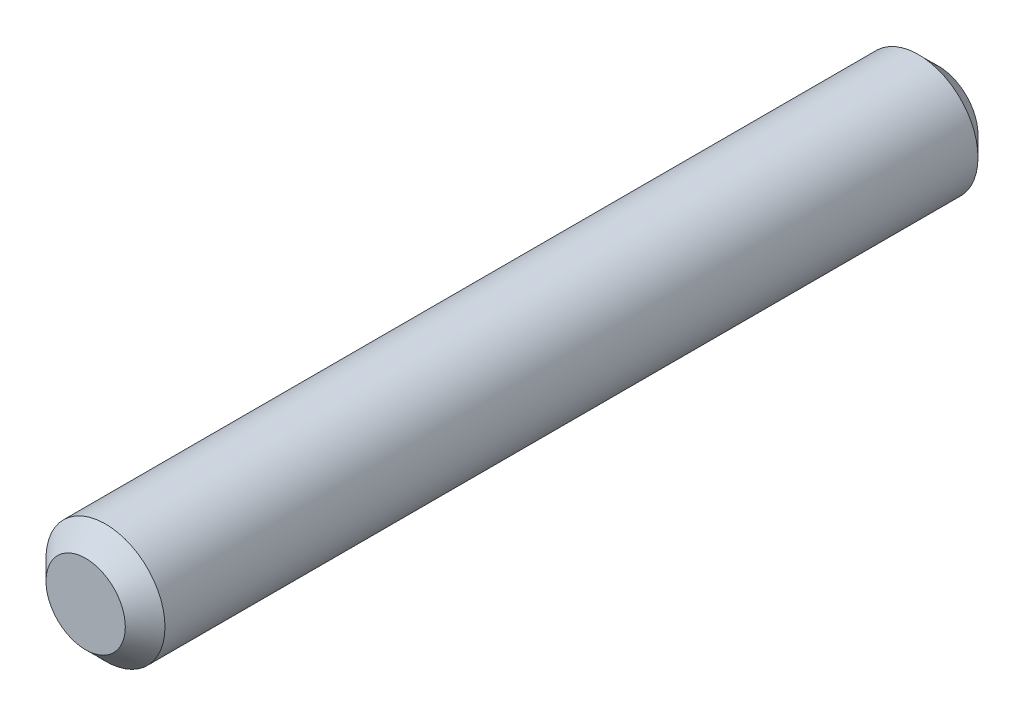
ISO-10303-21;
HEADER;
FILE_DESCRIPTION(('STEP AP214'),'2;1');
FILE_NAME('part.step','',(''),(''),'','','');
FILE_SCHEMA(('AUTOMOTIVE_DESIGN { 1 0 10303 214 1 1 1 1 }'));
ENDSEC;
DATA;
#1=APPLICATION_CONTEXT('core data for automotive mechanical design processes');
#2=APPLICATION_PROTOCOL_DEFINITION('international standard','automotive_design',2000,#1);
#3=PRODUCT_CONTEXT('',#1,'mechanical');
#4=PRODUCT('Part','Part','',(#3));
#5=PRODUCT_RELATED_PRODUCT_CATEGORY('part','',(#4));
#6=PRODUCT_DEFINITION_FORMATION('','',#4);
#7=PRODUCT_DEFINITION_CONTEXT('part definition',#1,'design');
#8=PRODUCT_DEFINITION('design','',#6,#7);
#9=PRODUCT_DEFINITION_SHAPE('','',#8);
#10=(LENGTH_UNIT() NAMED_UNIT(*) SI_UNIT(.MILLI.,.METRE.));
#11=(NAMED_UNIT(*) PLANE_ANGLE_UNIT() SI_UNIT($,.RADIAN.));
#12=(NAMED_UNIT(*) SI_UNIT($,.STERADIAN.) SOLID_ANGLE_UNIT());
#13=UNCERTAINTY_MEASURE_WITH_UNIT(LENGTH_MEASURE(1.E-05),#10,'distance_accuracy_value','');
#14=(GEOMETRIC_REPRESENTATION_CONTEXT(3) GLOBAL_UNCERTAINTY_ASSIGNED_CONTEXT((#13)) GLOBAL_UNIT_ASSIGNED_CONTEXT((#10,
#11,#12)) REPRESENTATION_CONTEXT('',''));
#15=CARTESIAN_POINT('',(0.,0.,0.));
#16=DIRECTION('',(0.,0.,1.));
#17=DIRECTION('',(1.,0.,0.));
#18=AXIS2_PLACEMENT_3D('',#15,#16,#17);
#19=CARTESIAN_POINT('',(0.,0.,43.));
#20=DIRECTION('',(0.,0.,-1.));
#21=DIRECTION('',(-1.,0.,0.));
#22=AXIS2_PLACEMENT_3D('',#19,#20,#21);
#23=CYLINDRICAL_SURFACE('',#22,3.);
#24=CARTESIAN_POINT('',(0.,0.,1.00000000000001));
#25=DIRECTION('',(0.,0.,1.));
#26=DIRECTION('',(1.,0.,0.));
#27=AXIS2_PLACEMENT_3D('',#24,#25,#26);
#28=CIRCLE('',#27,3.);
#29=CARTESIAN_POINT('',(3.,0.,1.00000000000001));
#30=VERTEX_POINT('',#29);
#31=EDGE_CURVE('E52',#30,#30,#28,.T.);
#32=ORIENTED_EDGE('',*,*,#31,.T.);
#33=EDGE_LOOP('',(#32));
#34=FACE_BOUND('',#33,.T.);
#35=CARTESIAN_POINT('',(0.,0.,42.));
#36=DIRECTION('',(0.,0.,1.));
#37=DIRECTION('',(1.,0.,0.));
#38=AXIS2_PLACEMENT_3D('',#35,#36,#37);
#39=CIRCLE('',#38,3.);
#40=CARTESIAN_POINT('',(3.,0.,42.));
#41=VERTEX_POINT('',#40);
#42=EDGE_CURVE('E60',#41,#41,#39,.F.);
#43=ORIENTED_EDGE('',*,*,#42,.T.);
#44=EDGE_LOOP('',(#43));
#45=FACE_BOUND('',#44,.T.);
#46=ADVANCED_FACE('F41',(#34,#45),#23,.T.);
#47=CARTESIAN_POINT('',(0.,0.,43.));
#48=DIRECTION('',(0.,0.,1.));
#49=DIRECTION('',(1.,0.,0.));
#50=AXIS2_PLACEMENT_3D('',#47,#48,#49);
#51=PLANE('',#50);
#52=CARTESIAN_POINT('',(0.,0.,43.));
#53=DIRECTION('',(0.,0.,1.));
#54=DIRECTION('',(1.,0.,0.));
#55=AXIS2_PLACEMENT_3D('',#52,#53,#54);
#56=CIRCLE('',#55,1.99999999999999);
#57=CARTESIAN_POINT('',(1.99999999999999,0.,43.));
#58=VERTEX_POINT('',#57);
#59=EDGE_CURVE('E10',#58,#58,#56,.T.);
#60=ORIENTED_EDGE('',*,*,#59,.T.);
#61=EDGE_LOOP('',(#60));
#62=FACE_BOUND('',#61,.T.);
#63=ADVANCED_FACE('F71',(#62),#51,.T.);
#64=CARTESIAN_POINT('',(0.,0.,0.));
#65=DIRECTION('',(0.,0.,1.));
#66=DIRECTION('',(1.,0.,0.));
#67=AXIS2_PLACEMENT_3D('',#64,#65,#66);
#68=PLANE('',#67);
#69=CARTESIAN_POINT('',(0.,0.,0.));
#70=DIRECTION('',(0.,0.,1.));
#71=DIRECTION('',(1.,0.,0.));
#72=AXIS2_PLACEMENT_3D('',#69,#70,#71);
#73=CIRCLE('',#72,1.99999999999999);
#74=CARTESIAN_POINT('',(1.99999999999999,0.,0.));
#75=VERTEX_POINT('',#74);
#76=EDGE_CURVE('E47',#75,#75,#73,.F.);
#77=ORIENTED_EDGE('',*,*,#76,.T.);
#78=EDGE_LOOP('',(#77));
#79=FACE_BOUND('',#78,.T.);
#80=ADVANCED_FACE('F68',(#79),#68,.F.);
#81=CARTESIAN_POINT('',(0.,0.,1.00000000000001));
#82=DIRECTION('',(0.,0.,1.));
#83=DIRECTION('',(1.,0.,0.));
#84=AXIS2_PLACEMENT_3D('',#81,#82,#83);
#85=CONICAL_SURFACE('',#84,3.,0.78539816339745);
#86=ORIENTED_EDGE('',*,*,#76,.F.);
#87=EDGE_LOOP('',(#86));
#88=FACE_BOUND('',#87,.T.);
#89=ORIENTED_EDGE('',*,*,#31,.F.);
#90=EDGE_LOOP('',(#89));
#91=FACE_BOUND('',#90,.T.);
#92=ADVANCED_FACE('F67',(#88,#91),#85,.T.);
#93=CARTESIAN_POINT('',(0.,0.,43.));
#94=DIRECTION('',(0.,0.,-1.));
#95=DIRECTION('',(-1.,0.,0.));
#96=AXIS2_PLACEMENT_3D('',#93,#94,#95);
#97=CONICAL_SURFACE('',#96,1.99999999999999,0.785398163397447);
#98=ORIENTED_EDGE('',*,*,#42,.F.);
#99=EDGE_LOOP('',(#98));
#100=FACE_BOUND('',#99,.T.);
#101=ORIENTED_EDGE('',*,*,#59,.F.);
#102=EDGE_LOOP('',(#101));
#103=FACE_BOUND('',#102,.T.);
#104=ADVANCED_FACE('F42',(#100,#103),#97,.T.);
#105=CLOSED_SHELL('',(#46,#63,#80,#92,#104));
#106=MANIFOLD_SOLID_BREP('B2',#105);
#107=ADVANCED_BREP_SHAPE_REPRESENTATION('',(#18,#106),#14);
#108=SHAPE_DEFINITION_REPRESENTATION(#9,#107);
ENDSEC;
END-ISO-10303-21;
